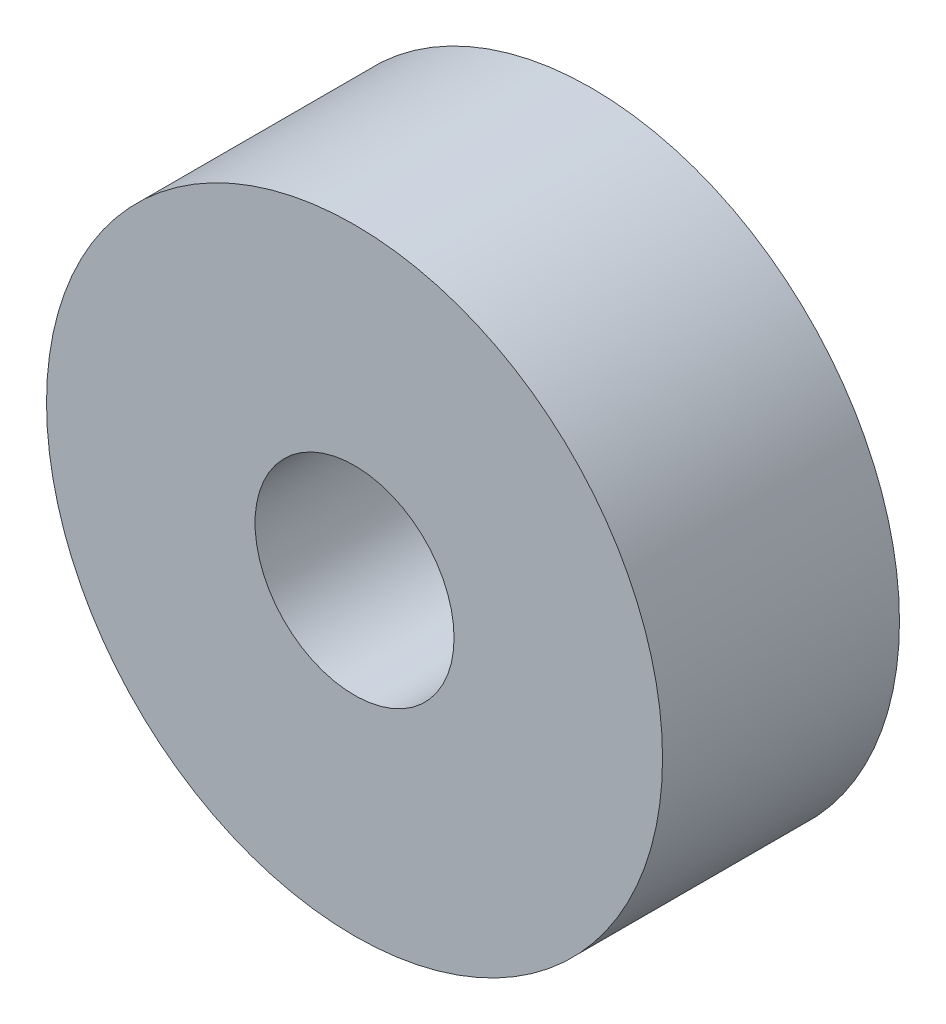
ISO-10303-21;
HEADER;
FILE_DESCRIPTION(('STEP AP214'),'2;1');
FILE_NAME('part.step','',(''),(''),'','','');
FILE_SCHEMA(('AUTOMOTIVE_DESIGN { 1 0 10303 214 1 1 1 1 }'));
ENDSEC;
DATA;
#1=APPLICATION_CONTEXT('core data for automotive mechanical design processes');
#2=APPLICATION_PROTOCOL_DEFINITION('international standard','automotive_design',2000,#1);
#3=PRODUCT_CONTEXT('',#1,'mechanical');
#4=PRODUCT('Part','Part','',(#3));
#5=PRODUCT_RELATED_PRODUCT_CATEGORY('part','',(#4));
#6=PRODUCT_DEFINITION_FORMATION('','',#4);
#7=PRODUCT_DEFINITION_CONTEXT('part definition',#1,'design');
#8=PRODUCT_DEFINITION('design','',#6,#7);
#9=PRODUCT_DEFINITION_SHAPE('','',#8);
#10=(LENGTH_UNIT() NAMED_UNIT(*) SI_UNIT(.MILLI.,.METRE.));
#11=(NAMED_UNIT(*) PLANE_ANGLE_UNIT() SI_UNIT($,.RADIAN.));
#12=(NAMED_UNIT(*) SI_UNIT($,.STERADIAN.) SOLID_ANGLE_UNIT());
#13=UNCERTAINTY_MEASURE_WITH_UNIT(LENGTH_MEASURE(1.E-05),#10,'distance_accuracy_value','');
#14=(GEOMETRIC_REPRESENTATION_CONTEXT(3) GLOBAL_UNCERTAINTY_ASSIGNED_CONTEXT((#13)) GLOBAL_UNIT_ASSIGNED_CONTEXT((#10,
#11,#12)) REPRESENTATION_CONTEXT('',''));
#15=CARTESIAN_POINT('',(0.,0.,0.));
#16=DIRECTION('',(0.,0.,1.));
#17=DIRECTION('',(1.,0.,0.));
#18=AXIS2_PLACEMENT_3D('',#15,#16,#17);
#19=CARTESIAN_POINT('',(0.,0.,5.));
#20=DIRECTION('',(0.,0.,1.));
#21=DIRECTION('',(1.,0.,0.));
#22=AXIS2_PLACEMENT_3D('',#19,#20,#21);
#23=PLANE('',#22);
#24=CARTESIAN_POINT('',(0.,0.,5.));
#25=DIRECTION('',(0.,0.,1.));
#26=DIRECTION('',(1.,0.,0.));
#27=AXIS2_PLACEMENT_3D('',#24,#25,#26);
#28=CIRCLE('',#27,6.5);
#29=CARTESIAN_POINT('',(6.5,0.,5.));
#30=VERTEX_POINT('',#29);
#31=EDGE_CURVE('E10',#30,#30,#28,.T.);
#32=ORIENTED_EDGE('',*,*,#31,.T.);
#33=EDGE_LOOP('',(#32));
#34=FACE_BOUND('',#33,.T.);
#35=CARTESIAN_POINT('',(0.,0.,5.));
#36=DIRECTION('',(0.,0.,1.));
#37=DIRECTION('',(1.,0.,0.));
#38=AXIS2_PLACEMENT_3D('',#35,#36,#37);
#39=CIRCLE('',#38,2.1);
#40=CARTESIAN_POINT('',(2.1,0.,5.));
#41=VERTEX_POINT('',#40);
#42=EDGE_CURVE('E43',#41,#41,#39,.T.);
#43=ORIENTED_EDGE('',*,*,#42,.F.);
#44=EDGE_LOOP('',(#43));
#45=FACE_BOUND('',#44,.T.);
#46=ADVANCED_FACE('F32',(#34,#45),#23,.T.);
#47=CARTESIAN_POINT('',(0.,0.,0.));
#48=DIRECTION('',(0.,0.,1.));
#49=DIRECTION('',(1.,0.,0.));
#50=AXIS2_PLACEMENT_3D('',#47,#48,#49);
#51=PLANE('',#50);
#52=CARTESIAN_POINT('',(0.,0.,0.));
#53=DIRECTION('',(0.,0.,1.));
#54=DIRECTION('',(1.,0.,0.));
#55=AXIS2_PLACEMENT_3D('',#52,#53,#54);
#56=CIRCLE('',#55,6.5);
#57=CARTESIAN_POINT('',(6.5,0.,0.));
#58=VERTEX_POINT('',#57);
#59=EDGE_CURVE('E36',#58,#58,#56,.T.);
#60=ORIENTED_EDGE('',*,*,#59,.F.);
#61=EDGE_LOOP('',(#60));
#62=FACE_BOUND('',#61,.T.);
#63=CARTESIAN_POINT('',(0.,0.,0.));
#64=DIRECTION('',(0.,0.,1.));
#65=DIRECTION('',(1.,0.,0.));
#66=AXIS2_PLACEMENT_3D('',#63,#64,#65);
#67=CIRCLE('',#66,2.1);
#68=CARTESIAN_POINT('',(2.1,0.,0.));
#69=VERTEX_POINT('',#68);
#70=EDGE_CURVE('E45',#69,#69,#67,.T.);
#71=ORIENTED_EDGE('',*,*,#70,.T.);
#72=EDGE_LOOP('',(#71));
#73=FACE_BOUND('',#72,.T.);
#74=ADVANCED_FACE('F55',(#62,#73),#51,.F.);
#75=CARTESIAN_POINT('',(0.,0.,5.));
#76=DIRECTION('',(0.,0.,-1.));
#77=DIRECTION('',(-1.,0.,0.));
#78=AXIS2_PLACEMENT_3D('',#75,#76,#77);
#79=CYLINDRICAL_SURFACE('',#78,6.5);
#80=ORIENTED_EDGE('',*,*,#31,.F.);
#81=EDGE_LOOP('',(#80));
#82=FACE_BOUND('',#81,.T.);
#83=ORIENTED_EDGE('',*,*,#59,.T.);
#84=EDGE_LOOP('',(#83));
#85=FACE_BOUND('',#84,.T.);
#86=ADVANCED_FACE('F34',(#82,#85),#79,.T.);
#87=CARTESIAN_POINT('',(0.,0.,5.));
#88=DIRECTION('',(0.,0.,-1.));
#89=DIRECTION('',(-1.,0.,0.));
#90=AXIS2_PLACEMENT_3D('',#87,#88,#89);
#91=CYLINDRICAL_SURFACE('',#90,2.1);
#92=ORIENTED_EDGE('',*,*,#42,.T.);
#93=EDGE_LOOP('',(#92));
#94=FACE_BOUND('',#93,.T.);
#95=ORIENTED_EDGE('',*,*,#70,.F.);
#96=EDGE_LOOP('',(#95));
#97=FACE_BOUND('',#96,.T.);
#98=ADVANCED_FACE('F51',(#94,#97),#91,.F.);
#99=CLOSED_SHELL('',(#46,#74,#86,#98));
#100=MANIFOLD_SOLID_BREP('B2',#99);
#101=ADVANCED_BREP_SHAPE_REPRESENTATION('',(#18,#100),#14);
#102=SHAPE_DEFINITION_REPRESENTATION(#9,#101);
ENDSEC;
END-ISO-10303-21;
